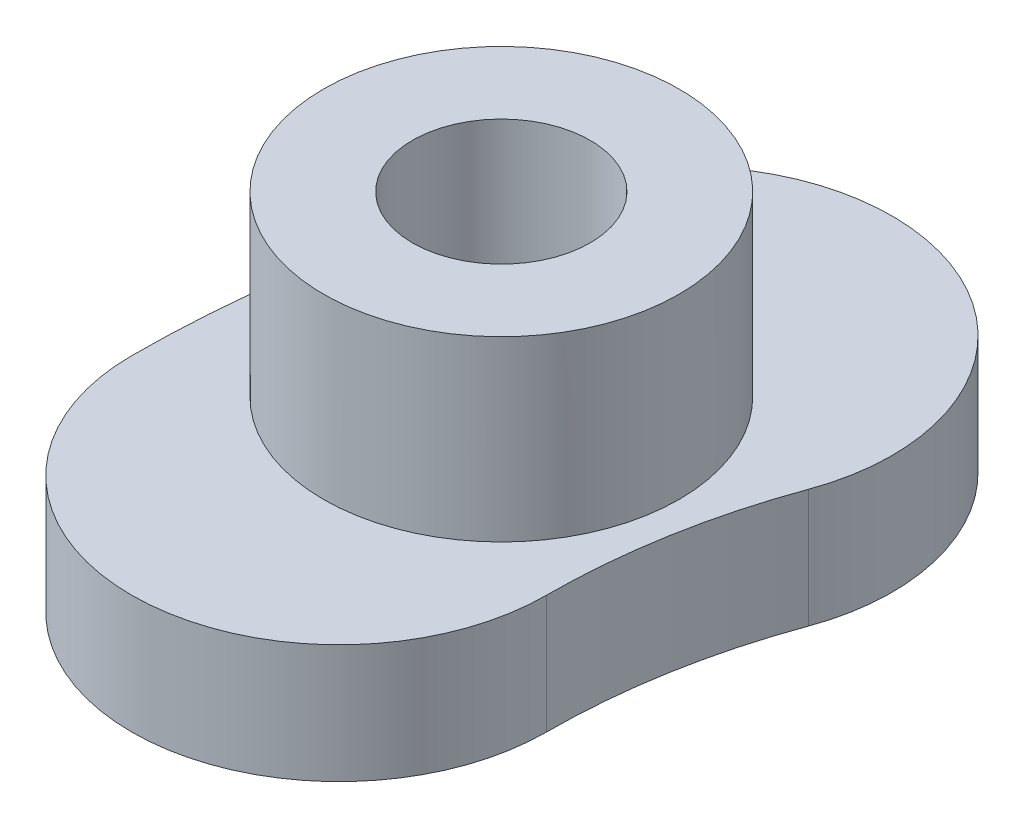
ISO-10303-21;
HEADER;
FILE_DESCRIPTION(('STEP AP214'),'2;1');
FILE_NAME('part.step','',(''),(''),'','','');
FILE_SCHEMA(('AUTOMOTIVE_DESIGN { 1 0 10303 214 1 1 1 1 }'));
ENDSEC;
DATA;
#1=APPLICATION_CONTEXT('core data for automotive mechanical design processes');
#2=APPLICATION_PROTOCOL_DEFINITION('international standard','automotive_design',2000,#1);
#3=PRODUCT_CONTEXT('',#1,'mechanical');
#4=PRODUCT('Part','Part','',(#3));
#5=PRODUCT_RELATED_PRODUCT_CATEGORY('part','',(#4));
#6=PRODUCT_DEFINITION_FORMATION('','',#4);
#7=PRODUCT_DEFINITION_CONTEXT('part definition',#1,'design');
#8=PRODUCT_DEFINITION('design','',#6,#7);
#9=PRODUCT_DEFINITION_SHAPE('','',#8);
#10=(LENGTH_UNIT() NAMED_UNIT(*) SI_UNIT(.MILLI.,.METRE.));
#11=(NAMED_UNIT(*) PLANE_ANGLE_UNIT() SI_UNIT($,.RADIAN.));
#12=(NAMED_UNIT(*) SI_UNIT($,.STERADIAN.) SOLID_ANGLE_UNIT());
#13=UNCERTAINTY_MEASURE_WITH_UNIT(LENGTH_MEASURE(1.E-05),#10,'distance_accuracy_value','');
#14=(GEOMETRIC_REPRESENTATION_CONTEXT(3) GLOBAL_UNCERTAINTY_ASSIGNED_CONTEXT((#13)) GLOBAL_UNIT_ASSIGNED_CONTEXT((#10,
#11,#12)) REPRESENTATION_CONTEXT('',''));
#15=CARTESIAN_POINT('',(0.,0.,0.));
#16=DIRECTION('',(0.,0.,1.));
#17=DIRECTION('',(1.,0.,0.));
#18=AXIS2_PLACEMENT_3D('',#15,#16,#17);
#19=CARTESIAN_POINT('',(0.,2.,0.));
#20=DIRECTION('',(0.,1.,0.));
#21=DIRECTION('',(0.,0.,1.));
#22=AXIS2_PLACEMENT_3D('',#19,#20,#21);
#23=PLANE('',#22);
#24=CARTESIAN_POINT('',(0.,2.,0.));
#25=DIRECTION('',(0.,1.,0.));
#26=DIRECTION('',(0.,0.,1.));
#27=AXIS2_PLACEMENT_3D('',#24,#25,#26);
#28=CIRCLE('',#27,18.);
#29=CARTESIAN_POINT('',(-16.9144671741464,2.,-6.15636257986194));
#30=VERTEX_POINT('',#29);
#31=CARTESIAN_POINT('',(-18.,2.,0.));
#32=VERTEX_POINT('',#31);
#33=EDGE_CURVE('E93',#30,#32,#28,.T.);
#34=ORIENTED_EDGE('',*,*,#33,.T.);
#35=CARTESIAN_POINT('',(-14.5,2.,0.));
#36=DIRECTION('',(0.,1.,0.));
#37=DIRECTION('',(0.,0.,1.));
#38=AXIS2_PLACEMENT_3D('',#35,#36,#37);
#39=CIRCLE('',#38,3.5);
#40=CARTESIAN_POINT('',(-11.,2.,0.));
#41=VERTEX_POINT('',#40);
#42=EDGE_CURVE('E88',#32,#41,#39,.T.);
#43=ORIENTED_EDGE('',*,*,#42,.T.);
#44=CARTESIAN_POINT('',(0.,2.,0.));
#45=DIRECTION('',(0.,1.,0.));
#46=DIRECTION('',(0.,0.,1.));
#47=AXIS2_PLACEMENT_3D('',#44,#45,#46);
#48=CIRCLE('',#47,11.);
#49=CARTESIAN_POINT('',(-10.336618828645,2.,-3.7622215765823));
#50=VERTEX_POINT('',#49);
#51=EDGE_CURVE('E91',#50,#41,#48,.T.);
#52=ORIENTED_EDGE('',*,*,#51,.F.);
#53=CARTESIAN_POINT('',(-13.6255430013957,2.,-4.95929207822211));
#54=DIRECTION('',(0.,1.,0.));
#55=DIRECTION('',(0.,0.,1.));
#56=AXIS2_PLACEMENT_3D('',#53,#54,#55);
#57=CIRCLE('',#56,3.5);
#58=EDGE_CURVE('E62',#50,#30,#57,.T.);
#59=ORIENTED_EDGE('',*,*,#58,.T.);
#60=EDGE_LOOP('',(#34,#43,#52,#59));
#61=FACE_BOUND('',#60,.T.);
#62=CARTESIAN_POINT('',(-14.279712418677,2.,-2.51789857617045));
#63=DIRECTION('',(0.,1.,0.));
#64=DIRECTION('',(0.,0.,1.));
#65=AXIS2_PLACEMENT_3D('',#62,#63,#64);
#66=CIRCLE('',#65,3.);
#67=CARTESIAN_POINT('',(-14.279712418677,2.,0.482101423829553));
#68=VERTEX_POINT('',#67);
#69=EDGE_CURVE('E112',#68,#68,#66,.F.);
#70=ORIENTED_EDGE('',*,*,#69,.T.);
#71=EDGE_LOOP('',(#70));
#72=FACE_BOUND('',#71,.T.);
#73=ADVANCED_FACE('F45',(#61,#72),#23,.T.);
#74=CARTESIAN_POINT('',(0.,2.,0.));
#75=DIRECTION('',(0.,-1.,0.));
#76=DIRECTION('',(0.,0.,-1.));
#77=AXIS2_PLACEMENT_3D('',#74,#75,#76);
#78=CYLINDRICAL_SURFACE('',#77,18.);
#79=CARTESIAN_POINT('',(0.,0.,0.));
#80=DIRECTION('',(0.,1.,0.));
#81=DIRECTION('',(0.,0.,1.));
#82=AXIS2_PLACEMENT_3D('',#79,#80,#81);
#83=CIRCLE('',#82,18.);
#84=CARTESIAN_POINT('',(-16.9144671741464,0.,-6.15636257986194));
#85=VERTEX_POINT('',#84);
#86=CARTESIAN_POINT('',(-18.,0.,0.));
#87=VERTEX_POINT('',#86);
#88=EDGE_CURVE('E111',#85,#87,#83,.T.);
#89=ORIENTED_EDGE('',*,*,#88,.T.);
#90=DIRECTION('',(0.,-1.,0.));
#91=VECTOR('',#90,1.);
#92=CARTESIAN_POINT('',(-18.,2.,0.));
#93=LINE('',#92,#91);
#94=EDGE_CURVE('E12',#32,#87,#93,.T.);
#95=ORIENTED_EDGE('',*,*,#94,.F.);
#96=ORIENTED_EDGE('',*,*,#33,.F.);
#97=DIRECTION('',(0.,-1.,0.));
#98=VECTOR('',#97,1.);
#99=CARTESIAN_POINT('',(-16.9144671741464,2.,-6.15636257986194));
#100=LINE('',#99,#98);
#101=EDGE_CURVE('E104',#30,#85,#100,.T.);
#102=ORIENTED_EDGE('',*,*,#101,.T.);
#103=EDGE_LOOP('',(#89,#95,#96,#102));
#104=FACE_BOUND('',#103,.T.);
#105=ADVANCED_FACE('F122',(#104),#78,.T.);
#106=CARTESIAN_POINT('',(-14.5,2.,0.));
#107=DIRECTION('',(0.,-1.,0.));
#108=DIRECTION('',(0.,0.,-1.));
#109=AXIS2_PLACEMENT_3D('',#106,#107,#108);
#110=CYLINDRICAL_SURFACE('',#109,3.5);
#111=CARTESIAN_POINT('',(-14.5,0.,0.));
#112=DIRECTION('',(0.,1.,0.));
#113=DIRECTION('',(0.,0.,1.));
#114=AXIS2_PLACEMENT_3D('',#111,#112,#113);
#115=CIRCLE('',#114,3.5);
#116=CARTESIAN_POINT('',(-11.,0.,0.));
#117=VERTEX_POINT('',#116);
#118=EDGE_CURVE('E98',#87,#117,#115,.T.);
#119=ORIENTED_EDGE('',*,*,#118,.T.);
#120=DIRECTION('',(0.,-1.,0.));
#121=VECTOR('',#120,1.);
#122=CARTESIAN_POINT('',(-11.,2.,0.));
#123=LINE('',#122,#121);
#124=EDGE_CURVE('E54',#41,#117,#123,.T.);
#125=ORIENTED_EDGE('',*,*,#124,.F.);
#126=ORIENTED_EDGE('',*,*,#42,.F.);
#127=ORIENTED_EDGE('',*,*,#94,.T.);
#128=EDGE_LOOP('',(#119,#125,#126,#127));
#129=FACE_BOUND('',#128,.T.);
#130=ADVANCED_FACE('F97',(#129),#110,.T.);
#131=CARTESIAN_POINT('',(0.,2.,0.));
#132=DIRECTION('',(0.,-1.,0.));
#133=DIRECTION('',(0.,0.,-1.));
#134=AXIS2_PLACEMENT_3D('',#131,#132,#133);
#135=CYLINDRICAL_SURFACE('',#134,11.);
#136=CARTESIAN_POINT('',(0.,0.,0.));
#137=DIRECTION('',(0.,1.,0.));
#138=DIRECTION('',(0.,0.,1.));
#139=AXIS2_PLACEMENT_3D('',#136,#137,#138);
#140=CIRCLE('',#139,11.);
#141=CARTESIAN_POINT('',(-10.336618828645,0.,-3.7622215765823));
#142=VERTEX_POINT('',#141);
#143=EDGE_CURVE('E116',#142,#117,#140,.T.);
#144=ORIENTED_EDGE('',*,*,#143,.F.);
#145=DIRECTION('',(0.,-1.,0.));
#146=VECTOR('',#145,1.);
#147=CARTESIAN_POINT('',(-10.336618828645,2.,-3.7622215765823));
#148=LINE('',#147,#146);
#149=EDGE_CURVE('E78',#50,#142,#148,.T.);
#150=ORIENTED_EDGE('',*,*,#149,.F.);
#151=ORIENTED_EDGE('',*,*,#51,.T.);
#152=ORIENTED_EDGE('',*,*,#124,.T.);
#153=EDGE_LOOP('',(#144,#150,#151,#152));
#154=FACE_BOUND('',#153,.T.);
#155=ADVANCED_FACE('F102',(#154),#135,.F.);
#156=CARTESIAN_POINT('',(-14.279712418677,2.,-2.51789857617045));
#157=DIRECTION('',(0.,-1.,0.));
#158=DIRECTION('',(0.,0.,-1.));
#159=AXIS2_PLACEMENT_3D('',#156,#157,#158);
#160=CYLINDRICAL_SURFACE('',#159,1.5);
#161=CARTESIAN_POINT('',(-14.279712418677,0.,-2.51789857617045));
#162=DIRECTION('',(0.,1.,0.));
#163=DIRECTION('',(0.,0.,1.));
#164=AXIS2_PLACEMENT_3D('',#161,#162,#163);
#165=CIRCLE('',#164,1.5);
#166=CARTESIAN_POINT('',(-14.279712418677,0.,-1.01789857617045));
#167=VERTEX_POINT('',#166);
#168=EDGE_CURVE('E108',#167,#167,#165,.T.);
#169=ORIENTED_EDGE('',*,*,#168,.F.);
#170=EDGE_LOOP('',(#169));
#171=FACE_BOUND('',#170,.T.);
#172=CARTESIAN_POINT('',(-14.279712418677,5.,-2.51789857617045));
#173=DIRECTION('',(0.,1.,0.));
#174=DIRECTION('',(0.,0.,1.));
#175=AXIS2_PLACEMENT_3D('',#172,#173,#174);
#176=CIRCLE('',#175,1.5);
#177=CARTESIAN_POINT('',(-14.279712418677,5.,-1.01789857617045));
#178=VERTEX_POINT('',#177);
#179=EDGE_CURVE('E154',#178,#178,#176,.T.);
#180=ORIENTED_EDGE('',*,*,#179,.T.);
#181=EDGE_LOOP('',(#180));
#182=FACE_BOUND('',#181,.T.);
#183=ADVANCED_FACE('F47',(#171,#182),#160,.F.);
#184=CARTESIAN_POINT('',(-13.6255430013957,2.,-4.95929207822211));
#185=DIRECTION('',(0.,-1.,0.));
#186=DIRECTION('',(0.,0.,-1.));
#187=AXIS2_PLACEMENT_3D('',#184,#185,#186);
#188=CYLINDRICAL_SURFACE('',#187,3.5);
#189=CARTESIAN_POINT('',(-13.6255430013957,0.,-4.95929207822211));
#190=DIRECTION('',(0.,1.,0.));
#191=DIRECTION('',(0.,0.,1.));
#192=AXIS2_PLACEMENT_3D('',#189,#190,#191);
#193=CIRCLE('',#192,3.5);
#194=EDGE_CURVE('E81',#142,#85,#193,.T.);
#195=ORIENTED_EDGE('',*,*,#194,.T.);
#196=ORIENTED_EDGE('',*,*,#101,.F.);
#197=ORIENTED_EDGE('',*,*,#58,.F.);
#198=ORIENTED_EDGE('',*,*,#149,.T.);
#199=EDGE_LOOP('',(#195,#196,#197,#198));
#200=FACE_BOUND('',#199,.T.);
#201=ADVANCED_FACE('F127',(#200),#188,.T.);
#202=CARTESIAN_POINT('',(0.,0.,0.));
#203=DIRECTION('',(0.,1.,0.));
#204=DIRECTION('',(0.,0.,1.));
#205=AXIS2_PLACEMENT_3D('',#202,#203,#204);
#206=PLANE('',#205);
#207=ORIENTED_EDGE('',*,*,#168,.T.);
#208=EDGE_LOOP('',(#207));
#209=FACE_BOUND('',#208,.T.);
#210=ORIENTED_EDGE('',*,*,#88,.F.);
#211=ORIENTED_EDGE('',*,*,#194,.F.);
#212=ORIENTED_EDGE('',*,*,#143,.T.);
#213=ORIENTED_EDGE('',*,*,#118,.F.);
#214=EDGE_LOOP('',(#210,#211,#212,#213));
#215=FACE_BOUND('',#214,.T.);
#216=ADVANCED_FACE('F124',(#209,#215),#206,.F.);
#217=CARTESIAN_POINT('',(-14.279712418677,5.,-2.51789857617045));
#218=DIRECTION('',(0.,1.,0.));
#219=DIRECTION('',(0.,0.,1.));
#220=AXIS2_PLACEMENT_3D('',#217,#218,#219);
#221=PLANE('',#220);
#222=CARTESIAN_POINT('',(-14.279712418677,5.,-2.51789857617045));
#223=DIRECTION('',(0.,1.,0.));
#224=DIRECTION('',(1.,0.,0.));
#225=AXIS2_PLACEMENT_3D('',#222,#223,#224);
#226=CIRCLE('',#225,3.);
#227=CARTESIAN_POINT('',(-11.279712418677,5.,-2.51789857617045));
#228=VERTEX_POINT('',#227);
#229=EDGE_CURVE('E153',#228,#228,#226,.T.);
#230=ORIENTED_EDGE('',*,*,#229,.T.);
#231=EDGE_LOOP('',(#230));
#232=FACE_BOUND('',#231,.T.);
#233=ORIENTED_EDGE('',*,*,#179,.F.);
#234=EDGE_LOOP('',(#233));
#235=FACE_BOUND('',#234,.T.);
#236=ADVANCED_FACE('F126',(#232,#235),#221,.T.);
#237=CARTESIAN_POINT('',(-14.279712418677,5.,-2.51789857617045));
#238=DIRECTION('',(0.,-1.,0.));
#239=DIRECTION('',(0.,0.,-1.));
#240=AXIS2_PLACEMENT_3D('',#237,#238,#239);
#241=CYLINDRICAL_SURFACE('',#240,3.);
#242=ORIENTED_EDGE('',*,*,#69,.F.);
#243=EDGE_LOOP('',(#242));
#244=FACE_BOUND('',#243,.T.);
#245=ORIENTED_EDGE('',*,*,#229,.F.);
#246=EDGE_LOOP('',(#245));
#247=FACE_BOUND('',#246,.T.);
#248=ADVANCED_FACE('F134',(#244,#247),#241,.T.);
#249=CLOSED_SHELL('',(#73,#105,#130,#155,#183,#201,#216,#236,#248));
#250=MANIFOLD_SOLID_BREP('B2',#249);
#251=ADVANCED_BREP_SHAPE_REPRESENTATION('',(#18,#250),#14);
#252=SHAPE_DEFINITION_REPRESENTATION(#9,#251);
ENDSEC;
END-ISO-10303-21;
